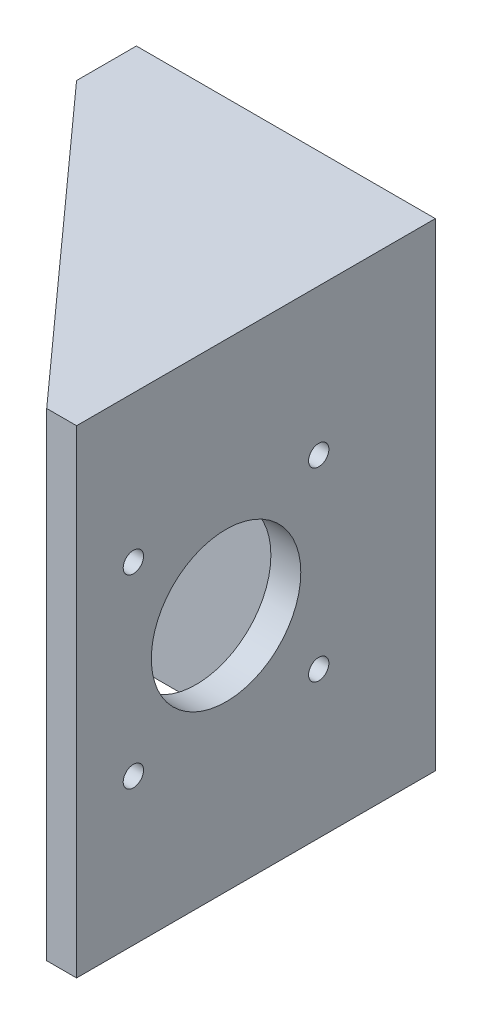
ISO-10303-21;
HEADER;
FILE_DESCRIPTION(('STEP AP214'),'2;1');
FILE_NAME('part.step','',(''),(''),'','','');
FILE_SCHEMA(('AUTOMOTIVE_DESIGN { 1 0 10303 214 1 1 1 1 }'));
ENDSEC;
DATA;
#1=APPLICATION_CONTEXT('core data for automotive mechanical design processes');
#2=APPLICATION_PROTOCOL_DEFINITION('international standard','automotive_design',2000,#1);
#3=PRODUCT_CONTEXT('',#1,'mechanical');
#4=PRODUCT('Part','Part','',(#3));
#5=PRODUCT_RELATED_PRODUCT_CATEGORY('part','',(#4));
#6=PRODUCT_DEFINITION_FORMATION('','',#4);
#7=PRODUCT_DEFINITION_CONTEXT('part definition',#1,'design');
#8=PRODUCT_DEFINITION('design','',#6,#7);
#9=PRODUCT_DEFINITION_SHAPE('','',#8);
#10=(LENGTH_UNIT() NAMED_UNIT(*) SI_UNIT(.MILLI.,.METRE.));
#11=(NAMED_UNIT(*) PLANE_ANGLE_UNIT() SI_UNIT($,.RADIAN.));
#12=(NAMED_UNIT(*) SI_UNIT($,.STERADIAN.) SOLID_ANGLE_UNIT());
#13=UNCERTAINTY_MEASURE_WITH_UNIT(LENGTH_MEASURE(1.E-05),#10,'distance_accuracy_value','');
#14=(GEOMETRIC_REPRESENTATION_CONTEXT(3) GLOBAL_UNCERTAINTY_ASSIGNED_CONTEXT((#13)) GLOBAL_UNIT_ASSIGNED_CONTEXT((#10,
#11,#12)) REPRESENTATION_CONTEXT('',''));
#15=CARTESIAN_POINT('',(0.,0.,0.));
#16=DIRECTION('',(0.,0.,1.));
#17=DIRECTION('',(1.,0.,0.));
#18=AXIS2_PLACEMENT_3D('',#15,#16,#17);
#19=CARTESIAN_POINT('',(0.,0.,10.));
#20=DIRECTION('',(0.,0.,1.));
#21=DIRECTION('',(1.,0.,0.));
#22=AXIS2_PLACEMENT_3D('',#19,#20,#21);
#23=PLANE('',#22);
#24=CARTESIAN_POINT('',(10.9029313913286,24.76,10.));
#25=DIRECTION('',(0.,0.,1.));
#26=DIRECTION('',(1.,0.,0.));
#27=AXIS2_PLACEMENT_3D('',#24,#25,#26);
#28=CIRCLE('',#27,5.);
#29=CARTESIAN_POINT('',(15.9029313913286,24.76,10.));
#30=VERTEX_POINT('',#29);
#31=EDGE_CURVE('E274',#30,#30,#28,.T.);
#32=ORIENTED_EDGE('',*,*,#31,.F.);
#33=EDGE_LOOP('',(#32));
#34=FACE_BOUND('',#33,.T.);
#35=CARTESIAN_POINT('',(-15.9029313913286,-24.76,10.));
#36=DIRECTION('',(0.,0.,1.));
#37=DIRECTION('',(1.,0.,0.));
#38=AXIS2_PLACEMENT_3D('',#35,#36,#37);
#39=CIRCLE('',#38,5.);
#40=CARTESIAN_POINT('',(-10.9029313913286,-24.76,10.));
#41=VERTEX_POINT('',#40);
#42=EDGE_CURVE('E290',#41,#41,#39,.T.);
#43=ORIENTED_EDGE('',*,*,#42,.F.);
#44=EDGE_LOOP('',(#43));
#45=FACE_BOUND('',#44,.T.);
#46=CARTESIAN_POINT('',(10.9029313913286,-24.76,10.));
#47=DIRECTION('',(0.,0.,1.));
#48=DIRECTION('',(1.,0.,0.));
#49=AXIS2_PLACEMENT_3D('',#46,#47,#48);
#50=CIRCLE('',#49,5.);
#51=CARTESIAN_POINT('',(15.9029313913286,-24.76,10.));
#52=VERTEX_POINT('',#51);
#53=EDGE_CURVE('E306',#52,#52,#50,.T.);
#54=ORIENTED_EDGE('',*,*,#53,.F.);
#55=EDGE_LOOP('',(#54));
#56=FACE_BOUND('',#55,.T.);
#57=CARTESIAN_POINT('',(-15.9029313913286,24.76,10.));
#58=DIRECTION('',(0.,0.,1.));
#59=DIRECTION('',(1.,0.,0.));
#60=AXIS2_PLACEMENT_3D('',#57,#58,#59);
#61=CIRCLE('',#60,5.);
#62=CARTESIAN_POINT('',(-10.9029313913286,24.76,10.));
#63=VERTEX_POINT('',#62);
#64=EDGE_CURVE('E322',#63,#63,#61,.T.);
#65=ORIENTED_EDGE('',*,*,#64,.F.);
#66=EDGE_LOOP('',(#65));
#67=FACE_BOUND('',#66,.T.);
#68=DIRECTION('',(0.,-1.,0.));
#69=VECTOR('',#68,1.);
#70=CARTESIAN_POINT('',(18.,0.,10.));
#71=LINE('',#70,#69);
#72=CARTESIAN_POINT('',(18.,-40.,10.));
#73=VERTEX_POINT('',#72);
#74=CARTESIAN_POINT('',(18.,33.65,10.));
#75=VERTEX_POINT('',#74);
#76=EDGE_CURVE('E149',#73,#75,#71,.F.);
#77=ORIENTED_EDGE('',*,*,#76,.T.);
#78=DIRECTION('',(-1.,0.,0.));
#79=VECTOR('',#78,1.);
#80=CARTESIAN_POINT('',(-25.,33.65,10.));
#81=LINE('',#80,#79);
#82=CARTESIAN_POINT('',(-25.,33.65,10.));
#83=VERTEX_POINT('',#82);
#84=EDGE_CURVE('E140',#75,#83,#81,.T.);
#85=ORIENTED_EDGE('',*,*,#84,.T.);
#86=DIRECTION('',(0.,-1.,0.));
#87=VECTOR('',#86,1.);
#88=CARTESIAN_POINT('',(-25.,-40.,10.));
#89=LINE('',#88,#87);
#90=CARTESIAN_POINT('',(-25.,-40.,10.));
#91=VERTEX_POINT('',#90);
#92=EDGE_CURVE('E135',#83,#91,#89,.T.);
#93=ORIENTED_EDGE('',*,*,#92,.T.);
#94=DIRECTION('',(1.,0.,0.));
#95=VECTOR('',#94,1.);
#96=CARTESIAN_POINT('',(25.,-40.,10.));
#97=LINE('',#96,#95);
#98=EDGE_CURVE('E134',#91,#73,#97,.T.);
#99=ORIENTED_EDGE('',*,*,#98,.T.);
#100=EDGE_LOOP('',(#77,#85,#93,#99));
#101=FACE_BOUND('',#100,.T.);
#102=ADVANCED_FACE('F56',(#34,#45,#56,#67,#101),#23,.T.);
#103=CARTESIAN_POINT('',(20.,40.,60.));
#104=DIRECTION('',(1.,0.,0.));
#105=DIRECTION('',(0.,1.,0.));
#106=AXIS2_PLACEMENT_3D('',#103,#104,#105);
#107=PLANE('',#106);
#108=CARTESIAN_POINT('',(20.,0.,35.));
#109=DIRECTION('',(1.,0.,0.));
#110=DIRECTION('',(0.,1.,0.));
#111=AXIS2_PLACEMENT_3D('',#108,#109,#110);
#112=CIRCLE('',#111,12.5);
#113=CARTESIAN_POINT('',(20.,12.5,35.));
#114=VERTEX_POINT('',#113);
#115=EDGE_CURVE('E189',#114,#114,#112,.T.);
#116=ORIENTED_EDGE('',*,*,#115,.T.);
#117=EDGE_LOOP('',(#116));
#118=FACE_BOUND('',#117,.T.);
#119=CARTESIAN_POINT('',(20.,-15.5,50.5));
#120=DIRECTION('',(1.,0.,0.));
#121=DIRECTION('',(0.,1.,0.));
#122=AXIS2_PLACEMENT_3D('',#119,#120,#121);
#123=CIRCLE('',#122,1.7);
#124=CARTESIAN_POINT('',(20.,-13.8,50.5));
#125=VERTEX_POINT('',#124);
#126=EDGE_CURVE('E195',#125,#125,#123,.T.);
#127=ORIENTED_EDGE('',*,*,#126,.T.);
#128=EDGE_LOOP('',(#127));
#129=FACE_BOUND('',#128,.T.);
#130=CARTESIAN_POINT('',(20.,15.5,19.5));
#131=DIRECTION('',(1.,0.,0.));
#132=DIRECTION('',(0.,1.,0.));
#133=AXIS2_PLACEMENT_3D('',#130,#131,#132);
#134=CIRCLE('',#133,1.7);
#135=CARTESIAN_POINT('',(20.,17.2,19.5));
#136=VERTEX_POINT('',#135);
#137=EDGE_CURVE('E200',#136,#136,#134,.T.);
#138=ORIENTED_EDGE('',*,*,#137,.T.);
#139=EDGE_LOOP('',(#138));
#140=FACE_BOUND('',#139,.T.);
#141=CARTESIAN_POINT('',(20.,-15.5,19.5));
#142=DIRECTION('',(1.,0.,0.));
#143=DIRECTION('',(0.,1.,0.));
#144=AXIS2_PLACEMENT_3D('',#141,#142,#143);
#145=CIRCLE('',#144,1.7);
#146=CARTESIAN_POINT('',(20.,-13.8,19.5));
#147=VERTEX_POINT('',#146);
#148=EDGE_CURVE('E205',#147,#147,#145,.T.);
#149=ORIENTED_EDGE('',*,*,#148,.T.);
#150=EDGE_LOOP('',(#149));
#151=FACE_BOUND('',#150,.T.);
#152=CARTESIAN_POINT('',(20.,15.5,50.5));
#153=DIRECTION('',(1.,0.,0.));
#154=DIRECTION('',(0.,1.,0.));
#155=AXIS2_PLACEMENT_3D('',#152,#153,#154);
#156=CIRCLE('',#155,1.7);
#157=CARTESIAN_POINT('',(20.,17.2,50.5));
#158=VERTEX_POINT('',#157);
#159=EDGE_CURVE('E210',#158,#158,#156,.T.);
#160=ORIENTED_EDGE('',*,*,#159,.T.);
#161=EDGE_LOOP('',(#160));
#162=FACE_BOUND('',#161,.T.);
#163=DIRECTION('',(0.,0.,-1.));
#164=VECTOR('',#163,1.);
#165=CARTESIAN_POINT('',(20.,33.65,60.));
#166=LINE('',#165,#164);
#167=CARTESIAN_POINT('',(20.,33.65,60.));
#168=VERTEX_POINT('',#167);
#169=CARTESIAN_POINT('',(20.,33.65,12.));
#170=VERTEX_POINT('',#169);
#171=EDGE_CURVE('E142',#168,#170,#166,.T.);
#172=ORIENTED_EDGE('',*,*,#171,.T.);
#173=DIRECTION('',(0.,-1.,0.));
#174=VECTOR('',#173,1.);
#175=CARTESIAN_POINT('',(20.,40.,12.));
#176=LINE('',#175,#174);
#177=CARTESIAN_POINT('',(20.,-40.,12.));
#178=VERTEX_POINT('',#177);
#179=EDGE_CURVE('E79',#170,#178,#176,.T.);
#180=ORIENTED_EDGE('',*,*,#179,.T.);
#181=DIRECTION('',(0.,0.,-1.));
#182=VECTOR('',#181,1.);
#183=CARTESIAN_POINT('',(20.,-40.,60.));
#184=LINE('',#183,#182);
#185=CARTESIAN_POINT('',(20.,-40.,60.));
#186=VERTEX_POINT('',#185);
#187=EDGE_CURVE('E164',#186,#178,#184,.T.);
#188=ORIENTED_EDGE('',*,*,#187,.F.);
#189=DIRECTION('',(0.,-1.,0.));
#190=VECTOR('',#189,1.);
#191=CARTESIAN_POINT('',(20.,40.,60.));
#192=LINE('',#191,#190);
#193=EDGE_CURVE('E252',#168,#186,#192,.T.);
#194=ORIENTED_EDGE('',*,*,#193,.F.);
#195=EDGE_LOOP('',(#172,#180,#188,#194));
#196=FACE_BOUND('',#195,.T.);
#197=ADVANCED_FACE('F264',(#118,#129,#140,#151,#162,#196),#107,.F.);
#198=CARTESIAN_POINT('',(18.,40.,12.));
#199=DIRECTION('',(0.,-1.,0.));
#200=DIRECTION('',(1.,0.,0.));
#201=AXIS2_PLACEMENT_3D('',#198,#199,#200);
#202=CYLINDRICAL_SURFACE('',#201,2.);
#203=CARTESIAN_POINT('',(18.,33.65,12.));
#204=DIRECTION('',(0.,1.,0.));
#205=DIRECTION('',(0.,0.,1.));
#206=AXIS2_PLACEMENT_3D('',#203,#204,#205);
#207=CIRCLE('',#206,2.);
#208=EDGE_CURVE('E13',#75,#170,#207,.F.);
#209=ORIENTED_EDGE('',*,*,#208,.F.);
#210=ORIENTED_EDGE('',*,*,#76,.F.);
#211=CARTESIAN_POINT('',(18.,-40.,12.));
#212=DIRECTION('',(0.,1.,0.));
#213=DIRECTION('',(-1.,0.,0.));
#214=AXIS2_PLACEMENT_3D('',#211,#212,#213);
#215=CIRCLE('',#214,2.);
#216=EDGE_CURVE('E65',#178,#73,#215,.T.);
#217=ORIENTED_EDGE('',*,*,#216,.F.);
#218=ORIENTED_EDGE('',*,*,#179,.F.);
#219=EDGE_LOOP('',(#209,#210,#217,#218));
#220=FACE_BOUND('',#219,.T.);
#221=ADVANCED_FACE('F58',(#220),#202,.F.);
#222=CARTESIAN_POINT('',(25.,-40.,10.));
#223=DIRECTION('',(-1.,0.,0.));
#224=DIRECTION('',(0.,0.,1.));
#225=AXIS2_PLACEMENT_3D('',#222,#223,#224);
#226=PLANE('',#225);
#227=CARTESIAN_POINT('',(25.,15.5,50.5));
#228=DIRECTION('',(1.,0.,0.));
#229=DIRECTION('',(0.,0.,-1.));
#230=AXIS2_PLACEMENT_3D('',#227,#228,#229);
#231=CIRCLE('',#230,1.7);
#232=CARTESIAN_POINT('',(25.,15.5,48.8));
#233=VERTEX_POINT('',#232);
#234=EDGE_CURVE('E214',#233,#233,#231,.T.);
#235=ORIENTED_EDGE('',*,*,#234,.F.);
#236=EDGE_LOOP('',(#235));
#237=FACE_BOUND('',#236,.T.);
#238=CARTESIAN_POINT('',(25.,-15.5,19.5));
#239=DIRECTION('',(1.,0.,0.));
#240=DIRECTION('',(0.,0.,-1.));
#241=AXIS2_PLACEMENT_3D('',#238,#239,#240);
#242=CIRCLE('',#241,1.7);
#243=CARTESIAN_POINT('',(25.,-15.5,17.8));
#244=VERTEX_POINT('',#243);
#245=EDGE_CURVE('E209',#244,#244,#242,.T.);
#246=ORIENTED_EDGE('',*,*,#245,.F.);
#247=EDGE_LOOP('',(#246));
#248=FACE_BOUND('',#247,.T.);
#249=CARTESIAN_POINT('',(25.,15.5,19.5));
#250=DIRECTION('',(1.,0.,0.));
#251=DIRECTION('',(0.,0.,-1.));
#252=AXIS2_PLACEMENT_3D('',#249,#250,#251);
#253=CIRCLE('',#252,1.7);
#254=CARTESIAN_POINT('',(25.,15.5,17.8));
#255=VERTEX_POINT('',#254);
#256=EDGE_CURVE('E204',#255,#255,#253,.T.);
#257=ORIENTED_EDGE('',*,*,#256,.F.);
#258=EDGE_LOOP('',(#257));
#259=FACE_BOUND('',#258,.T.);
#260=CARTESIAN_POINT('',(25.,0.,35.));
#261=DIRECTION('',(1.,0.,0.));
#262=DIRECTION('',(0.,0.,-1.));
#263=AXIS2_PLACEMENT_3D('',#260,#261,#262);
#264=CIRCLE('',#263,12.5);
#265=CARTESIAN_POINT('',(25.,0.,22.5));
#266=VERTEX_POINT('',#265);
#267=EDGE_CURVE('E194',#266,#266,#264,.T.);
#268=ORIENTED_EDGE('',*,*,#267,.F.);
#269=EDGE_LOOP('',(#268));
#270=FACE_BOUND('',#269,.T.);
#271=DIRECTION('',(0.,1.,0.));
#272=VECTOR('',#271,1.);
#273=CARTESIAN_POINT('',(25.,-40.,0.));
#274=LINE('',#273,#272);
#275=CARTESIAN_POINT('',(25.,-40.,0.));
#276=VERTEX_POINT('',#275);
#277=CARTESIAN_POINT('',(25.,40.,0.));
#278=VERTEX_POINT('',#277);
#279=EDGE_CURVE('E160',#276,#278,#274,.T.);
#280=ORIENTED_EDGE('',*,*,#279,.T.);
#281=DIRECTION('',(0.,0.,-1.));
#282=VECTOR('',#281,1.);
#283=CARTESIAN_POINT('',(25.,40.,10.));
#284=LINE('',#283,#282);
#285=CARTESIAN_POINT('',(25.,40.,60.));
#286=VERTEX_POINT('',#285);
#287=EDGE_CURVE('E179',#286,#278,#284,.T.);
#288=ORIENTED_EDGE('',*,*,#287,.F.);
#289=DIRECTION('',(0.,1.,0.));
#290=VECTOR('',#289,1.);
#291=CARTESIAN_POINT('',(25.,40.,60.));
#292=LINE('',#291,#290);
#293=CARTESIAN_POINT('',(25.,-40.,60.));
#294=VERTEX_POINT('',#293);
#295=EDGE_CURVE('E193',#294,#286,#292,.T.);
#296=ORIENTED_EDGE('',*,*,#295,.F.);
#297=DIRECTION('',(0.,0.,-1.));
#298=VECTOR('',#297,1.);
#299=CARTESIAN_POINT('',(25.,-40.,10.));
#300=LINE('',#299,#298);
#301=EDGE_CURVE('E183',#294,#276,#300,.T.);
#302=ORIENTED_EDGE('',*,*,#301,.T.);
#303=EDGE_LOOP('',(#280,#288,#296,#302));
#304=FACE_BOUND('',#303,.T.);
#305=CARTESIAN_POINT('',(25.,-15.5,50.5));
#306=DIRECTION('',(1.,0.,0.));
#307=DIRECTION('',(0.,0.,-1.));
#308=AXIS2_PLACEMENT_3D('',#305,#306,#307);
#309=CIRCLE('',#308,1.7);
#310=CARTESIAN_POINT('',(25.,-15.5,48.8));
#311=VERTEX_POINT('',#310);
#312=EDGE_CURVE('E199',#311,#311,#309,.T.);
#313=ORIENTED_EDGE('',*,*,#312,.F.);
#314=EDGE_LOOP('',(#313));
#315=FACE_BOUND('',#314,.T.);
#316=ADVANCED_FACE('F367',(#237,#248,#259,#270,#304,#315),#226,.F.);
#317=CARTESIAN_POINT('',(-25.,-40.,10.));
#318=DIRECTION('',(1.,0.,0.));
#319=DIRECTION('',(0.,0.,-1.));
#320=AXIS2_PLACEMENT_3D('',#317,#318,#319);
#321=PLANE('',#320);
#322=DIRECTION('',(0.,-1.,0.));
#323=VECTOR('',#322,1.);
#324=CARTESIAN_POINT('',(-25.,-40.,0.));
#325=LINE('',#324,#323);
#326=CARTESIAN_POINT('',(-25.,40.,0.));
#327=VERTEX_POINT('',#326);
#328=CARTESIAN_POINT('',(-25.,-40.,0.));
#329=VERTEX_POINT('',#328);
#330=EDGE_CURVE('E169',#327,#329,#325,.T.);
#331=ORIENTED_EDGE('',*,*,#330,.T.);
#332=DIRECTION('',(0.,0.,-1.));
#333=VECTOR('',#332,1.);
#334=CARTESIAN_POINT('',(-25.,-40.,10.));
#335=LINE('',#334,#333);
#336=EDGE_CURVE('E156',#91,#329,#335,.T.);
#337=ORIENTED_EDGE('',*,*,#336,.F.);
#338=ORIENTED_EDGE('',*,*,#92,.F.);
#339=CARTESIAN_POINT('',(-25.,40.,10.));
#340=VERTEX_POINT('',#339);
#341=EDGE_CURVE('E122',#340,#83,#89,.T.);
#342=ORIENTED_EDGE('',*,*,#341,.F.);
#343=DIRECTION('',(0.,0.,-1.));
#344=VECTOR('',#343,1.);
#345=CARTESIAN_POINT('',(-25.,40.,10.));
#346=LINE('',#345,#344);
#347=EDGE_CURVE('E168',#340,#327,#346,.T.);
#348=ORIENTED_EDGE('',*,*,#347,.T.);
#349=EDGE_LOOP('',(#331,#337,#338,#342,#348));
#350=FACE_BOUND('',#349,.T.);
#351=ADVANCED_FACE('F154',(#350),#321,.F.);
#352=CARTESIAN_POINT('',(25.,-40.,10.));
#353=DIRECTION('',(0.,1.,0.));
#354=DIRECTION('',(-1.,0.,0.));
#355=AXIS2_PLACEMENT_3D('',#352,#353,#354);
#356=PLANE('',#355);
#357=DIRECTION('',(1.,0.,0.));
#358=VECTOR('',#357,1.);
#359=CARTESIAN_POINT('',(25.,-40.,0.));
#360=LINE('',#359,#358);
#361=EDGE_CURVE('E172',#329,#276,#360,.T.);
#362=ORIENTED_EDGE('',*,*,#361,.T.);
#363=ORIENTED_EDGE('',*,*,#301,.F.);
#364=DIRECTION('',(1.,0.,0.));
#365=VECTOR('',#364,1.);
#366=CARTESIAN_POINT('',(25.,-40.,60.));
#367=LINE('',#366,#365);
#368=EDGE_CURVE('E256',#186,#294,#367,.T.);
#369=ORIENTED_EDGE('',*,*,#368,.F.);
#370=ORIENTED_EDGE('',*,*,#187,.T.);
#371=ORIENTED_EDGE('',*,*,#216,.T.);
#372=ORIENTED_EDGE('',*,*,#98,.F.);
#373=ORIENTED_EDGE('',*,*,#336,.T.);
#374=EDGE_LOOP('',(#362,#363,#369,#370,#371,#372,#373));
#375=FACE_BOUND('',#374,.T.);
#376=ADVANCED_FACE('F263',(#375),#356,.F.);
#377=CARTESIAN_POINT('',(25.,40.,10.));
#378=DIRECTION('',(0.,-1.,0.));
#379=DIRECTION('',(0.,0.,-1.));
#380=AXIS2_PLACEMENT_3D('',#377,#378,#379);
#381=PLANE('',#380);
#382=ORIENTED_EDGE('',*,*,#347,.F.);
#383=DIRECTION('',(0.66896473162245,0.,0.743294146247166));
#384=VECTOR('',#383,1.);
#385=CARTESIAN_POINT('',(-25.,40.,10.));
#386=LINE('',#385,#384);
#387=CARTESIAN_POINT('',(20.,40.,60.));
#388=VERTEX_POINT('',#387);
#389=EDGE_CURVE('E128',#340,#388,#386,.T.);
#390=ORIENTED_EDGE('',*,*,#389,.T.);
#391=DIRECTION('',(-1.,0.,0.));
#392=VECTOR('',#391,1.);
#393=CARTESIAN_POINT('',(25.,40.,60.));
#394=LINE('',#393,#392);
#395=EDGE_CURVE('E248',#286,#388,#394,.T.);
#396=ORIENTED_EDGE('',*,*,#395,.F.);
#397=ORIENTED_EDGE('',*,*,#287,.T.);
#398=DIRECTION('',(-1.,0.,0.));
#399=VECTOR('',#398,1.);
#400=CARTESIAN_POINT('',(25.,40.,0.));
#401=LINE('',#400,#399);
#402=EDGE_CURVE('E158',#278,#327,#401,.T.);
#403=ORIENTED_EDGE('',*,*,#402,.T.);
#404=EDGE_LOOP('',(#382,#390,#396,#397,#403));
#405=FACE_BOUND('',#404,.T.);
#406=ADVANCED_FACE('F269',(#405),#381,.F.);
#407=CARTESIAN_POINT('',(0.,0.,0.));
#408=DIRECTION('',(0.,0.,1.));
#409=DIRECTION('',(1.,0.,0.));
#410=AXIS2_PLACEMENT_3D('',#407,#408,#409);
#411=PLANE('',#410);
#412=CARTESIAN_POINT('',(10.9029313913286,24.76,0.));
#413=DIRECTION('',(0.,0.,1.));
#414=DIRECTION('',(1.,0.,0.));
#415=AXIS2_PLACEMENT_3D('',#412,#413,#414);
#416=CIRCLE('',#415,2.75);
#417=CARTESIAN_POINT('',(13.6529313913286,24.76,0.));
#418=VERTEX_POINT('',#417);
#419=EDGE_CURVE('E286',#418,#418,#416,.T.);
#420=ORIENTED_EDGE('',*,*,#419,.T.);
#421=EDGE_LOOP('',(#420));
#422=FACE_BOUND('',#421,.T.);
#423=CARTESIAN_POINT('',(-15.9029313913286,-24.76,0.));
#424=DIRECTION('',(0.,0.,1.));
#425=DIRECTION('',(1.,0.,0.));
#426=AXIS2_PLACEMENT_3D('',#423,#424,#425);
#427=CIRCLE('',#426,2.75);
#428=CARTESIAN_POINT('',(-13.1529313913286,-24.76,0.));
#429=VERTEX_POINT('',#428);
#430=EDGE_CURVE('E302',#429,#429,#427,.T.);
#431=ORIENTED_EDGE('',*,*,#430,.T.);
#432=EDGE_LOOP('',(#431));
#433=FACE_BOUND('',#432,.T.);
#434=CARTESIAN_POINT('',(10.9029313913286,-24.76,0.));
#435=DIRECTION('',(0.,0.,1.));
#436=DIRECTION('',(1.,0.,0.));
#437=AXIS2_PLACEMENT_3D('',#434,#435,#436);
#438=CIRCLE('',#437,2.75);
#439=CARTESIAN_POINT('',(13.6529313913286,-24.76,0.));
#440=VERTEX_POINT('',#439);
#441=EDGE_CURVE('E318',#440,#440,#438,.T.);
#442=ORIENTED_EDGE('',*,*,#441,.T.);
#443=EDGE_LOOP('',(#442));
#444=FACE_BOUND('',#443,.T.);
#445=CARTESIAN_POINT('',(-15.9029313913286,24.76,0.));
#446=DIRECTION('',(0.,0.,1.));
#447=DIRECTION('',(1.,0.,0.));
#448=AXIS2_PLACEMENT_3D('',#445,#446,#447);
#449=CIRCLE('',#448,2.75);
#450=CARTESIAN_POINT('',(-13.1529313913286,24.76,0.));
#451=VERTEX_POINT('',#450);
#452=EDGE_CURVE('E226',#451,#451,#449,.T.);
#453=ORIENTED_EDGE('',*,*,#452,.T.);
#454=EDGE_LOOP('',(#453));
#455=FACE_BOUND('',#454,.T.);
#456=ORIENTED_EDGE('',*,*,#330,.F.);
#457=ORIENTED_EDGE('',*,*,#402,.F.);
#458=ORIENTED_EDGE('',*,*,#279,.F.);
#459=ORIENTED_EDGE('',*,*,#361,.F.);
#460=EDGE_LOOP('',(#456,#457,#458,#459));
#461=FACE_BOUND('',#460,.T.);
#462=ADVANCED_FACE('F361',(#422,#433,#444,#455,#461),#411,.F.);
#463=CARTESIAN_POINT('',(0.,0.,60.));
#464=DIRECTION('',(0.,0.,-1.));
#465=DIRECTION('',(-1.,0.,0.));
#466=AXIS2_PLACEMENT_3D('',#463,#464,#465);
#467=PLANE('',#466);
#468=ORIENTED_EDGE('',*,*,#295,.T.);
#469=ORIENTED_EDGE('',*,*,#395,.T.);
#470=EDGE_CURVE('E253',#388,#168,#192,.T.);
#471=ORIENTED_EDGE('',*,*,#470,.T.);
#472=ORIENTED_EDGE('',*,*,#193,.T.);
#473=ORIENTED_EDGE('',*,*,#368,.T.);
#474=EDGE_LOOP('',(#468,#469,#471,#472,#473));
#475=FACE_BOUND('',#474,.T.);
#476=ADVANCED_FACE('F266',(#475),#467,.F.);
#477=CARTESIAN_POINT('',(-25.,0.,35.));
#478=DIRECTION('',(1.,0.,0.));
#479=DIRECTION('',(0.,0.,-1.));
#480=AXIS2_PLACEMENT_3D('',#477,#478,#479);
#481=CYLINDRICAL_SURFACE('',#480,12.5);
#482=ORIENTED_EDGE('',*,*,#267,.T.);
#483=EDGE_LOOP('',(#482));
#484=FACE_BOUND('',#483,.T.);
#485=ORIENTED_EDGE('',*,*,#115,.F.);
#486=EDGE_LOOP('',(#485));
#487=FACE_BOUND('',#486,.T.);
#488=ADVANCED_FACE('F392',(#484,#487),#481,.F.);
#489=CARTESIAN_POINT('',(25.,-15.5,50.5));
#490=DIRECTION('',(1.,0.,0.));
#491=DIRECTION('',(0.,0.,-1.));
#492=AXIS2_PLACEMENT_3D('',#489,#490,#491);
#493=CYLINDRICAL_SURFACE('',#492,1.7);
#494=ORIENTED_EDGE('',*,*,#312,.T.);
#495=EDGE_LOOP('',(#494));
#496=FACE_BOUND('',#495,.T.);
#497=ORIENTED_EDGE('',*,*,#126,.F.);
#498=EDGE_LOOP('',(#497));
#499=FACE_BOUND('',#498,.T.);
#500=ADVANCED_FACE('F546',(#496,#499),#493,.F.);
#501=CARTESIAN_POINT('',(25.,15.5,19.5));
#502=DIRECTION('',(1.,0.,0.));
#503=DIRECTION('',(0.,0.,-1.));
#504=AXIS2_PLACEMENT_3D('',#501,#502,#503);
#505=CYLINDRICAL_SURFACE('',#504,1.7);
#506=ORIENTED_EDGE('',*,*,#256,.T.);
#507=EDGE_LOOP('',(#506));
#508=FACE_BOUND('',#507,.T.);
#509=ORIENTED_EDGE('',*,*,#137,.F.);
#510=EDGE_LOOP('',(#509));
#511=FACE_BOUND('',#510,.T.);
#512=ADVANCED_FACE('F537',(#508,#511),#505,.F.);
#513=CARTESIAN_POINT('',(25.,-15.5,19.5));
#514=DIRECTION('',(1.,0.,0.));
#515=DIRECTION('',(0.,0.,-1.));
#516=AXIS2_PLACEMENT_3D('',#513,#514,#515);
#517=CYLINDRICAL_SURFACE('',#516,1.7);
#518=ORIENTED_EDGE('',*,*,#245,.T.);
#519=EDGE_LOOP('',(#518));
#520=FACE_BOUND('',#519,.T.);
#521=ORIENTED_EDGE('',*,*,#148,.F.);
#522=EDGE_LOOP('',(#521));
#523=FACE_BOUND('',#522,.T.);
#524=ADVANCED_FACE('F529',(#520,#523),#517,.F.);
#525=CARTESIAN_POINT('',(25.,15.5,50.5));
#526=DIRECTION('',(1.,0.,0.));
#527=DIRECTION('',(0.,0.,-1.));
#528=AXIS2_PLACEMENT_3D('',#525,#526,#527);
#529=CYLINDRICAL_SURFACE('',#528,1.7);
#530=ORIENTED_EDGE('',*,*,#234,.T.);
#531=EDGE_LOOP('',(#530));
#532=FACE_BOUND('',#531,.T.);
#533=ORIENTED_EDGE('',*,*,#159,.F.);
#534=EDGE_LOOP('',(#533));
#535=FACE_BOUND('',#534,.T.);
#536=ADVANCED_FACE('F520',(#532,#535),#529,.F.);
#537=CARTESIAN_POINT('',(-15.9029313913286,24.76,10.));
#538=DIRECTION('',(0.,0.,1.));
#539=DIRECTION('',(1.,0.,0.));
#540=AXIS2_PLACEMENT_3D('',#537,#538,#539);
#541=CYLINDRICAL_SURFACE('',#540,2.75);
#542=ORIENTED_EDGE('',*,*,#452,.F.);
#543=EDGE_LOOP('',(#542));
#544=FACE_BOUND('',#543,.T.);
#545=CARTESIAN_POINT('',(-15.9029313913286,24.76,5.));
#546=DIRECTION('',(0.,0.,1.));
#547=DIRECTION('',(1.,0.,0.));
#548=AXIS2_PLACEMENT_3D('',#545,#546,#547);
#549=CIRCLE('',#548,2.75);
#550=CARTESIAN_POINT('',(-13.1529313913286,24.76,5.));
#551=VERTEX_POINT('',#550);
#552=EDGE_CURVE('E232',#551,#551,#549,.T.);
#553=ORIENTED_EDGE('',*,*,#552,.T.);
#554=EDGE_LOOP('',(#553));
#555=FACE_BOUND('',#554,.T.);
#556=ADVANCED_FACE('F333',(#544,#555),#541,.F.);
#557=CARTESIAN_POINT('',(-13.1529313913286,24.76,5.));
#558=DIRECTION('',(0.,0.,-1.));
#559=DIRECTION('',(-1.,0.,0.));
#560=AXIS2_PLACEMENT_3D('',#557,#558,#559);
#561=PLANE('',#560);
#562=ORIENTED_EDGE('',*,*,#552,.F.);
#563=EDGE_LOOP('',(#562));
#564=FACE_BOUND('',#563,.T.);
#565=CARTESIAN_POINT('',(-15.9029313913286,24.76,5.));
#566=DIRECTION('',(0.,0.,1.));
#567=DIRECTION('',(1.,0.,0.));
#568=AXIS2_PLACEMENT_3D('',#565,#566,#567);
#569=CIRCLE('',#568,5.);
#570=CARTESIAN_POINT('',(-10.9029313913286,24.76,5.));
#571=VERTEX_POINT('',#570);
#572=EDGE_CURVE('E326',#571,#571,#569,.T.);
#573=ORIENTED_EDGE('',*,*,#572,.T.);
#574=EDGE_LOOP('',(#573));
#575=FACE_BOUND('',#574,.T.);
#576=ADVANCED_FACE('F335',(#564,#575),#561,.F.);
#577=CARTESIAN_POINT('',(-15.9029313913286,24.76,10.));
#578=DIRECTION('',(0.,0.,1.));
#579=DIRECTION('',(1.,0.,0.));
#580=AXIS2_PLACEMENT_3D('',#577,#578,#579);
#581=CYLINDRICAL_SURFACE('',#580,5.);
#582=ORIENTED_EDGE('',*,*,#572,.F.);
#583=EDGE_LOOP('',(#582));
#584=FACE_BOUND('',#583,.T.);
#585=ORIENTED_EDGE('',*,*,#64,.T.);
#586=EDGE_LOOP('',(#585));
#587=FACE_BOUND('',#586,.T.);
#588=ADVANCED_FACE('F338',(#584,#587),#581,.F.);
#589=CARTESIAN_POINT('',(10.9029313913286,-24.76,10.));
#590=DIRECTION('',(0.,0.,1.));
#591=DIRECTION('',(1.,0.,0.));
#592=AXIS2_PLACEMENT_3D('',#589,#590,#591);
#593=CYLINDRICAL_SURFACE('',#592,2.75);
#594=ORIENTED_EDGE('',*,*,#441,.F.);
#595=EDGE_LOOP('',(#594));
#596=FACE_BOUND('',#595,.T.);
#597=CARTESIAN_POINT('',(10.9029313913286,-24.76,5.));
#598=DIRECTION('',(0.,0.,1.));
#599=DIRECTION('',(1.,0.,0.));
#600=AXIS2_PLACEMENT_3D('',#597,#598,#599);
#601=CIRCLE('',#600,2.75);
#602=CARTESIAN_POINT('',(13.6529313913286,-24.76,5.));
#603=VERTEX_POINT('',#602);
#604=EDGE_CURVE('E314',#603,#603,#601,.T.);
#605=ORIENTED_EDGE('',*,*,#604,.T.);
#606=EDGE_LOOP('',(#605));
#607=FACE_BOUND('',#606,.T.);
#608=ADVANCED_FACE('F344',(#596,#607),#593,.F.);
#609=CARTESIAN_POINT('',(13.6529313913286,-24.76,5.));
#610=DIRECTION('',(0.,0.,-1.));
#611=DIRECTION('',(-1.,0.,0.));
#612=AXIS2_PLACEMENT_3D('',#609,#610,#611);
#613=PLANE('',#612);
#614=ORIENTED_EDGE('',*,*,#604,.F.);
#615=EDGE_LOOP('',(#614));
#616=FACE_BOUND('',#615,.T.);
#617=CARTESIAN_POINT('',(10.9029313913286,-24.76,5.));
#618=DIRECTION('',(0.,0.,1.));
#619=DIRECTION('',(1.,0.,0.));
#620=AXIS2_PLACEMENT_3D('',#617,#618,#619);
#621=CIRCLE('',#620,5.);
#622=CARTESIAN_POINT('',(15.9029313913286,-24.76,5.));
#623=VERTEX_POINT('',#622);
#624=EDGE_CURVE('E310',#623,#623,#621,.T.);
#625=ORIENTED_EDGE('',*,*,#624,.T.);
#626=EDGE_LOOP('',(#625));
#627=FACE_BOUND('',#626,.T.);
#628=ADVANCED_FACE('F485',(#616,#627),#613,.F.);
#629=CARTESIAN_POINT('',(10.9029313913286,-24.76,10.));
#630=DIRECTION('',(0.,0.,1.));
#631=DIRECTION('',(1.,0.,0.));
#632=AXIS2_PLACEMENT_3D('',#629,#630,#631);
#633=CYLINDRICAL_SURFACE('',#632,5.);
#634=ORIENTED_EDGE('',*,*,#624,.F.);
#635=EDGE_LOOP('',(#634));
#636=FACE_BOUND('',#635,.T.);
#637=ORIENTED_EDGE('',*,*,#53,.T.);
#638=EDGE_LOOP('',(#637));
#639=FACE_BOUND('',#638,.T.);
#640=ADVANCED_FACE('F476',(#636,#639),#633,.F.);
#641=CARTESIAN_POINT('',(-15.9029313913286,-24.76,10.));
#642=DIRECTION('',(0.,0.,1.));
#643=DIRECTION('',(1.,0.,0.));
#644=AXIS2_PLACEMENT_3D('',#641,#642,#643);
#645=CYLINDRICAL_SURFACE('',#644,2.75);
#646=ORIENTED_EDGE('',*,*,#430,.F.);
#647=EDGE_LOOP('',(#646));
#648=FACE_BOUND('',#647,.T.);
#649=CARTESIAN_POINT('',(-15.9029313913286,-24.76,5.));
#650=DIRECTION('',(0.,0.,1.));
#651=DIRECTION('',(1.,0.,0.));
#652=AXIS2_PLACEMENT_3D('',#649,#650,#651);
#653=CIRCLE('',#652,2.75);
#654=CARTESIAN_POINT('',(-13.1529313913286,-24.76,5.));
#655=VERTEX_POINT('',#654);
#656=EDGE_CURVE('E298',#655,#655,#653,.T.);
#657=ORIENTED_EDGE('',*,*,#656,.T.);
#658=EDGE_LOOP('',(#657));
#659=FACE_BOUND('',#658,.T.);
#660=ADVANCED_FACE('F467',(#648,#659),#645,.F.);
#661=CARTESIAN_POINT('',(-13.1529313913286,-24.76,5.));
#662=DIRECTION('',(0.,0.,-1.));
#663=DIRECTION('',(-1.,0.,0.));
#664=AXIS2_PLACEMENT_3D('',#661,#662,#663);
#665=PLANE('',#664);
#666=ORIENTED_EDGE('',*,*,#656,.F.);
#667=EDGE_LOOP('',(#666));
#668=FACE_BOUND('',#667,.T.);
#669=CARTESIAN_POINT('',(-15.9029313913286,-24.76,5.));
#670=DIRECTION('',(0.,0.,1.));
#671=DIRECTION('',(1.,0.,0.));
#672=AXIS2_PLACEMENT_3D('',#669,#670,#671);
#673=CIRCLE('',#672,5.);
#674=CARTESIAN_POINT('',(-10.9029313913286,-24.76,5.));
#675=VERTEX_POINT('',#674);
#676=EDGE_CURVE('E294',#675,#675,#673,.T.);
#677=ORIENTED_EDGE('',*,*,#676,.T.);
#678=EDGE_LOOP('',(#677));
#679=FACE_BOUND('',#678,.T.);
#680=ADVANCED_FACE('F458',(#668,#679),#665,.F.);
#681=CARTESIAN_POINT('',(-15.9029313913286,-24.76,10.));
#682=DIRECTION('',(0.,0.,1.));
#683=DIRECTION('',(1.,0.,0.));
#684=AXIS2_PLACEMENT_3D('',#681,#682,#683);
#685=CYLINDRICAL_SURFACE('',#684,5.);
#686=ORIENTED_EDGE('',*,*,#676,.F.);
#687=EDGE_LOOP('',(#686));
#688=FACE_BOUND('',#687,.T.);
#689=ORIENTED_EDGE('',*,*,#42,.T.);
#690=EDGE_LOOP('',(#689));
#691=FACE_BOUND('',#690,.T.);
#692=ADVANCED_FACE('F449',(#688,#691),#685,.F.);
#693=CARTESIAN_POINT('',(10.9029313913286,24.76,10.));
#694=DIRECTION('',(0.,0.,1.));
#695=DIRECTION('',(1.,0.,0.));
#696=AXIS2_PLACEMENT_3D('',#693,#694,#695);
#697=CYLINDRICAL_SURFACE('',#696,2.75);
#698=ORIENTED_EDGE('',*,*,#419,.F.);
#699=EDGE_LOOP('',(#698));
#700=FACE_BOUND('',#699,.T.);
#701=CARTESIAN_POINT('',(10.9029313913286,24.76,5.));
#702=DIRECTION('',(0.,0.,1.));
#703=DIRECTION('',(1.,0.,0.));
#704=AXIS2_PLACEMENT_3D('',#701,#702,#703);
#705=CIRCLE('',#704,2.75);
#706=CARTESIAN_POINT('',(13.6529313913286,24.76,5.));
#707=VERTEX_POINT('',#706);
#708=EDGE_CURVE('E282',#707,#707,#705,.T.);
#709=ORIENTED_EDGE('',*,*,#708,.T.);
#710=EDGE_LOOP('',(#709));
#711=FACE_BOUND('',#710,.T.);
#712=ADVANCED_FACE('F440',(#700,#711),#697,.F.);
#713=CARTESIAN_POINT('',(13.6529313913286,24.76,5.));
#714=DIRECTION('',(0.,0.,-1.));
#715=DIRECTION('',(-1.,0.,0.));
#716=AXIS2_PLACEMENT_3D('',#713,#714,#715);
#717=PLANE('',#716);
#718=ORIENTED_EDGE('',*,*,#708,.F.);
#719=EDGE_LOOP('',(#718));
#720=FACE_BOUND('',#719,.T.);
#721=CARTESIAN_POINT('',(10.9029313913286,24.76,5.));
#722=DIRECTION('',(0.,0.,1.));
#723=DIRECTION('',(1.,0.,0.));
#724=AXIS2_PLACEMENT_3D('',#721,#722,#723);
#725=CIRCLE('',#724,5.);
#726=CARTESIAN_POINT('',(15.9029313913286,24.76,5.));
#727=VERTEX_POINT('',#726);
#728=EDGE_CURVE('E278',#727,#727,#725,.T.);
#729=ORIENTED_EDGE('',*,*,#728,.T.);
#730=EDGE_LOOP('',(#729));
#731=FACE_BOUND('',#730,.T.);
#732=ADVANCED_FACE('F431',(#720,#731),#717,.F.);
#733=CARTESIAN_POINT('',(10.9029313913286,24.76,10.));
#734=DIRECTION('',(0.,0.,1.));
#735=DIRECTION('',(1.,0.,0.));
#736=AXIS2_PLACEMENT_3D('',#733,#734,#735);
#737=CYLINDRICAL_SURFACE('',#736,5.);
#738=ORIENTED_EDGE('',*,*,#728,.F.);
#739=EDGE_LOOP('',(#738));
#740=FACE_BOUND('',#739,.T.);
#741=ORIENTED_EDGE('',*,*,#31,.T.);
#742=EDGE_LOOP('',(#741));
#743=FACE_BOUND('',#742,.T.);
#744=ADVANCED_FACE('F399',(#740,#743),#737,.F.);
#745=CARTESIAN_POINT('',(0.,33.65,0.));
#746=DIRECTION('',(0.,1.,0.));
#747=DIRECTION('',(0.,0.,1.));
#748=AXIS2_PLACEMENT_3D('',#745,#746,#747);
#749=PLANE('',#748);
#750=ORIENTED_EDGE('',*,*,#84,.F.);
#751=ORIENTED_EDGE('',*,*,#208,.T.);
#752=ORIENTED_EDGE('',*,*,#171,.F.);
#753=DIRECTION('',(0.66896473162245,0.,0.743294146247166));
#754=VECTOR('',#753,1.);
#755=CARTESIAN_POINT('',(-25.,33.65,10.));
#756=LINE('',#755,#754);
#757=EDGE_CURVE('E125',#83,#168,#756,.T.);
#758=ORIENTED_EDGE('',*,*,#757,.F.);
#759=EDGE_LOOP('',(#750,#751,#752,#758));
#760=FACE_BOUND('',#759,.T.);
#761=ADVANCED_FACE('F139',(#760),#749,.F.);
#762=CARTESIAN_POINT('',(-25.,33.65,10.));
#763=DIRECTION('',(-0.743294146247166,0.,0.66896473162245));
#764=DIRECTION('',(0.66896473162245,0.,0.743294146247166));
#765=AXIS2_PLACEMENT_3D('',#762,#763,#764);
#766=PLANE('',#765);
#767=ORIENTED_EDGE('',*,*,#389,.F.);
#768=ORIENTED_EDGE('',*,*,#341,.T.);
#769=ORIENTED_EDGE('',*,*,#757,.T.);
#770=ORIENTED_EDGE('',*,*,#470,.F.);
#771=EDGE_LOOP('',(#767,#768,#769,#770));
#772=FACE_BOUND('',#771,.T.);
#773=ADVANCED_FACE('F124',(#772),#766,.T.);
#774=CLOSED_SHELL('',(#102,#197,#221,#316,#351,#376,#406,#462,#476,#488,#500,#512,#524,#536,
#556,#576,#588,#608,#628,#640,#660,#680,#692,#712,#732,#744,#761,#773));
#775=MANIFOLD_SOLID_BREP('B2',#774);
#776=ADVANCED_BREP_SHAPE_REPRESENTATION('',(#18,#775),#14);
#777=SHAPE_DEFINITION_REPRESENTATION(#9,#776);
ENDSEC;
END-ISO-10303-21;
